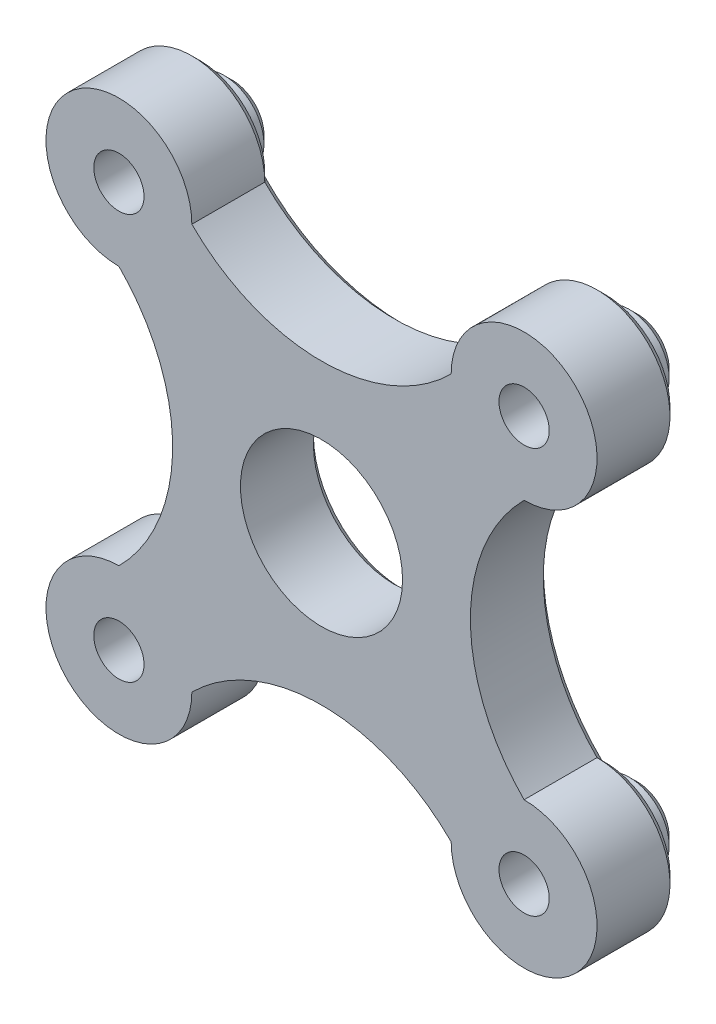
ISO-10303-21;
HEADER;
FILE_DESCRIPTION(('STEP AP214'),'2;1');
FILE_NAME('part.step','',(''),(''),'','','');
FILE_SCHEMA(('AUTOMOTIVE_DESIGN { 1 0 10303 214 1 1 1 1 }'));
ENDSEC;
DATA;
#1=APPLICATION_CONTEXT('core data for automotive mechanical design processes');
#2=APPLICATION_PROTOCOL_DEFINITION('international standard','automotive_design',2000,#1);
#3=PRODUCT_CONTEXT('',#1,'mechanical');
#4=PRODUCT('Part','Part','',(#3));
#5=PRODUCT_RELATED_PRODUCT_CATEGORY('part','',(#4));
#6=PRODUCT_DEFINITION_FORMATION('','',#4);
#7=PRODUCT_DEFINITION_CONTEXT('part definition',#1,'design');
#8=PRODUCT_DEFINITION('design','',#6,#7);
#9=PRODUCT_DEFINITION_SHAPE('','',#8);
#10=(LENGTH_UNIT() NAMED_UNIT(*) SI_UNIT(.MILLI.,.METRE.));
#11=(NAMED_UNIT(*) PLANE_ANGLE_UNIT() SI_UNIT($,.RADIAN.));
#12=(NAMED_UNIT(*) SI_UNIT($,.STERADIAN.) SOLID_ANGLE_UNIT());
#13=UNCERTAINTY_MEASURE_WITH_UNIT(LENGTH_MEASURE(1.E-05),#10,'distance_accuracy_value','');
#14=(GEOMETRIC_REPRESENTATION_CONTEXT(3) GLOBAL_UNCERTAINTY_ASSIGNED_CONTEXT((#13)) GLOBAL_UNIT_ASSIGNED_CONTEXT((#10,
#11,#12)) REPRESENTATION_CONTEXT('',''));
#15=CARTESIAN_POINT('',(0.,0.,0.));
#16=DIRECTION('',(0.,0.,1.));
#17=DIRECTION('',(1.,0.,0.));
#18=AXIS2_PLACEMENT_3D('',#15,#16,#17);
#19=CARTESIAN_POINT('',(12.5000000000003,-12.5,2.));
#20=DIRECTION('',(0.,0.,-1.));
#21=DIRECTION('',(-1.,0.,0.));
#22=AXIS2_PLACEMENT_3D('',#19,#20,#21);
#23=CYLINDRICAL_SURFACE('',#22,2.45);
#24=CARTESIAN_POINT('',(12.5000000000003,-12.5,0.500000000000007));
#25=DIRECTION('',(0.,0.,1.));
#26=DIRECTION('',(1.,0.,0.));
#27=AXIS2_PLACEMENT_3D('',#24,#25,#26);
#28=CIRCLE('',#27,2.45);
#29=CARTESIAN_POINT('',(14.9500000000003,-12.5,0.500000000000007));
#30=VERTEX_POINT('',#29);
#31=EDGE_CURVE('E198',#30,#30,#28,.T.);
#32=ORIENTED_EDGE('',*,*,#31,.T.);
#33=EDGE_LOOP('',(#32));
#34=FACE_BOUND('',#33,.T.);
#35=CARTESIAN_POINT('',(12.5000000000003,-12.5,2.));
#36=DIRECTION('',(0.,0.,1.));
#37=DIRECTION('',(1.,0.,0.));
#38=AXIS2_PLACEMENT_3D('',#35,#36,#37);
#39=CIRCLE('',#38,2.45);
#40=CARTESIAN_POINT('',(14.9500000000003,-12.5,2.));
#41=VERTEX_POINT('',#40);
#42=EDGE_CURVE('E172',#41,#41,#39,.T.);
#43=ORIENTED_EDGE('',*,*,#42,.F.);
#44=EDGE_LOOP('',(#43));
#45=FACE_BOUND('',#44,.T.);
#46=ADVANCED_FACE('F53',(#34,#45),#23,.T.);
#47=CARTESIAN_POINT('',(0.,0.,0.));
#48=DIRECTION('',(0.,0.,1.));
#49=DIRECTION('',(1.,0.,0.));
#50=AXIS2_PLACEMENT_3D('',#47,#48,#49);
#51=PLANE('',#50);
#52=CARTESIAN_POINT('',(12.5000000000003,-12.5,0.));
#53=DIRECTION('',(0.,0.,1.));
#54=DIRECTION('',(1.,0.,0.));
#55=AXIS2_PLACEMENT_3D('',#52,#53,#54);
#56=CIRCLE('',#55,1.94999999999999);
#57=CARTESIAN_POINT('',(14.4500000000003,-12.5,0.));
#58=VERTEX_POINT('',#57);
#59=EDGE_CURVE('E202',#58,#58,#56,.F.);
#60=ORIENTED_EDGE('',*,*,#59,.T.);
#61=EDGE_LOOP('',(#60));
#62=FACE_BOUND('',#61,.T.);
#63=CARTESIAN_POINT('',(12.5000000000003,-12.5,0.));
#64=DIRECTION('',(0.,0.,-1.));
#65=DIRECTION('',(-1.,0.,0.));
#66=AXIS2_PLACEMENT_3D('',#63,#64,#65);
#67=CIRCLE('',#66,1.55);
#68=CARTESIAN_POINT('',(10.9500000000003,-12.5,0.));
#69=VERTEX_POINT('',#68);
#70=EDGE_CURVE('E548',#69,#69,#67,.T.);
#71=ORIENTED_EDGE('',*,*,#70,.F.);
#72=EDGE_LOOP('',(#71));
#73=FACE_BOUND('',#72,.T.);
#74=ADVANCED_FACE('F448',(#62,#73),#51,.F.);
#75=CARTESIAN_POINT('',(-20.4999999999999,-1.30971622436249E-13,7.));
#76=DIRECTION('',(0.,0.,-1.));
#77=DIRECTION('',(-1.,0.,0.));
#78=AXIS2_PLACEMENT_3D('',#75,#76,#77);
#79=CYLINDRICAL_SURFACE('',#78,11.3137084989847);
#80=DIRECTION('',(0.,0.,-1.));
#81=VECTOR('',#80,1.);
#82=CARTESIAN_POINT('',(-12.5,7.99999999999998,7.));
#83=LINE('',#82,#81);
#84=CARTESIAN_POINT('',(-12.5,7.99999999999998,7.));
#85=VERTEX_POINT('',#84);
#86=CARTESIAN_POINT('',(-12.5,7.99999999999998,2.5));
#87=VERTEX_POINT('',#86);
#88=EDGE_CURVE('E403',#85,#87,#83,.T.);
#89=ORIENTED_EDGE('',*,*,#88,.T.);
#90=CARTESIAN_POINT('',(-20.4999999999999,-1.30971622436249E-13,2.5));
#91=DIRECTION('',(0.,0.,-1.));
#92=DIRECTION('',(-1.,0.,0.));
#93=AXIS2_PLACEMENT_3D('',#90,#91,#92);
#94=CIRCLE('',#93,11.3137084989847);
#95=CARTESIAN_POINT('',(-12.4999999999997,-7.99999999999984,2.5));
#96=VERTEX_POINT('',#95);
#97=EDGE_CURVE('E68',#87,#96,#94,.T.);
#98=ORIENTED_EDGE('',*,*,#97,.T.);
#99=DIRECTION('',(0.,0.,-1.));
#100=VECTOR('',#99,1.);
#101=CARTESIAN_POINT('',(-12.4999999999997,-7.99999999999984,7.));
#102=LINE('',#101,#100);
#103=CARTESIAN_POINT('',(-12.4999999999997,-7.99999999999984,7.));
#104=VERTEX_POINT('',#103);
#105=EDGE_CURVE('E153',#104,#96,#102,.T.);
#106=ORIENTED_EDGE('',*,*,#105,.F.);
#107=CARTESIAN_POINT('',(-20.4999999999999,-1.30971622436249E-13,7.));
#108=DIRECTION('',(0.,0.,-1.));
#109=DIRECTION('',(-1.,0.,0.));
#110=AXIS2_PLACEMENT_3D('',#107,#108,#109);
#111=CIRCLE('',#110,11.3137084989847);
#112=EDGE_CURVE('E161',#85,#104,#111,.T.);
#113=ORIENTED_EDGE('',*,*,#112,.F.);
#114=EDGE_LOOP('',(#89,#98,#106,#113));
#115=FACE_BOUND('',#114,.T.);
#116=ADVANCED_FACE('F170',(#115),#79,.F.);
#117=CARTESIAN_POINT('',(-12.4999999999997,-12.5,7.));
#118=DIRECTION('',(0.,0.,-1.));
#119=DIRECTION('',(-1.,0.,0.));
#120=AXIS2_PLACEMENT_3D('',#117,#118,#119);
#121=CYLINDRICAL_SURFACE('',#120,4.50000000000016);
#122=ORIENTED_EDGE('',*,*,#105,.T.);
#123=CARTESIAN_POINT('',(-12.4999999999997,-12.5,2.5));
#124=DIRECTION('',(0.,0.,-1.));
#125=DIRECTION('',(-1.,0.,0.));
#126=AXIS2_PLACEMENT_3D('',#123,#124,#125);
#127=CIRCLE('',#126,4.50000000000016);
#128=CARTESIAN_POINT('',(-7.99999999999977,-12.4999999999995,2.5));
#129=VERTEX_POINT('',#128);
#130=EDGE_CURVE('E12',#96,#129,#127,.F.);
#131=ORIENTED_EDGE('',*,*,#130,.T.);
#132=DIRECTION('',(0.,0.,-1.));
#133=VECTOR('',#132,1.);
#134=CARTESIAN_POINT('',(-7.99999999999977,-12.4999999999995,7.));
#135=LINE('',#134,#133);
#136=CARTESIAN_POINT('',(-7.99999999999977,-12.4999999999995,7.));
#137=VERTEX_POINT('',#136);
#138=EDGE_CURVE('E156',#137,#129,#135,.T.);
#139=ORIENTED_EDGE('',*,*,#138,.F.);
#140=CARTESIAN_POINT('',(-12.4999999999997,-12.5,7.));
#141=DIRECTION('',(0.,0.,1.));
#142=DIRECTION('',(1.,0.,0.));
#143=AXIS2_PLACEMENT_3D('',#140,#141,#142);
#144=CIRCLE('',#143,4.50000000000016);
#145=EDGE_CURVE('E150',#104,#137,#144,.T.);
#146=ORIENTED_EDGE('',*,*,#145,.F.);
#147=EDGE_LOOP('',(#122,#131,#139,#146));
#148=FACE_BOUND('',#147,.T.);
#149=ADVANCED_FACE('F152',(#148),#121,.T.);
#150=CARTESIAN_POINT('',(0.,-20.5,7.));
#151=DIRECTION('',(0.,0.,-1.));
#152=DIRECTION('',(-1.,0.,0.));
#153=AXIS2_PLACEMENT_3D('',#150,#151,#152);
#154=CYLINDRICAL_SURFACE('',#153,11.3137084989849);
#155=ORIENTED_EDGE('',*,*,#138,.T.);
#156=CARTESIAN_POINT('',(0.,-20.5,2.5));
#157=DIRECTION('',(0.,0.,-1.));
#158=DIRECTION('',(-1.,0.,0.));
#159=AXIS2_PLACEMENT_3D('',#156,#157,#158);
#160=CIRCLE('',#159,11.3137084989849);
#161=CARTESIAN_POINT('',(8.00000000000044,-12.4999999999996,2.5));
#162=VERTEX_POINT('',#161);
#163=EDGE_CURVE('E247',#129,#162,#160,.T.);
#164=ORIENTED_EDGE('',*,*,#163,.T.);
#165=DIRECTION('',(0.,0.,-1.));
#166=VECTOR('',#165,1.);
#167=CARTESIAN_POINT('',(8.00000000000044,-12.4999999999996,7.));
#168=LINE('',#167,#166);
#169=CARTESIAN_POINT('',(8.00000000000044,-12.4999999999996,7.));
#170=VERTEX_POINT('',#169);
#171=EDGE_CURVE('E179',#170,#162,#168,.T.);
#172=ORIENTED_EDGE('',*,*,#171,.F.);
#173=CARTESIAN_POINT('',(0.,-20.5,7.));
#174=DIRECTION('',(0.,0.,-1.));
#175=DIRECTION('',(-1.,0.,0.));
#176=AXIS2_PLACEMENT_3D('',#173,#174,#175);
#177=CIRCLE('',#176,11.3137084989849);
#178=EDGE_CURVE('E160',#137,#170,#177,.T.);
#179=ORIENTED_EDGE('',*,*,#178,.F.);
#180=EDGE_LOOP('',(#155,#164,#172,#179));
#181=FACE_BOUND('',#180,.T.);
#182=ADVANCED_FACE('F382',(#181),#154,.F.);
#183=CARTESIAN_POINT('',(12.5000000000003,-12.5,7.));
#184=DIRECTION('',(0.,0.,-1.));
#185=DIRECTION('',(-1.,0.,0.));
#186=AXIS2_PLACEMENT_3D('',#183,#184,#185);
#187=CYLINDRICAL_SURFACE('',#186,4.49999999999982);
#188=ORIENTED_EDGE('',*,*,#171,.T.);
#189=CARTESIAN_POINT('',(12.5000000000003,-12.5,2.5));
#190=DIRECTION('',(0.,0.,-1.));
#191=DIRECTION('',(-1.,0.,0.));
#192=AXIS2_PLACEMENT_3D('',#189,#190,#191);
#193=CIRCLE('',#192,4.49999999999982);
#194=CARTESIAN_POINT('',(12.5,-8.00000000000004,2.5));
#195=VERTEX_POINT('',#194);
#196=EDGE_CURVE('E251',#162,#195,#193,.F.);
#197=ORIENTED_EDGE('',*,*,#196,.T.);
#198=DIRECTION('',(0.,0.,-1.));
#199=VECTOR('',#198,1.);
#200=CARTESIAN_POINT('',(12.5,-8.00000000000004,7.));
#201=LINE('',#200,#199);
#202=CARTESIAN_POINT('',(12.5,-8.00000000000004,7.));
#203=VERTEX_POINT('',#202);
#204=EDGE_CURVE('E417',#203,#195,#201,.T.);
#205=ORIENTED_EDGE('',*,*,#204,.F.);
#206=CARTESIAN_POINT('',(12.5000000000003,-12.5,7.));
#207=DIRECTION('',(0.,0.,1.));
#208=DIRECTION('',(1.,0.,0.));
#209=AXIS2_PLACEMENT_3D('',#206,#207,#208);
#210=CIRCLE('',#209,4.49999999999982);
#211=EDGE_CURVE('E387',#170,#203,#210,.T.);
#212=ORIENTED_EDGE('',*,*,#211,.F.);
#213=EDGE_LOOP('',(#188,#197,#205,#212));
#214=FACE_BOUND('',#213,.T.);
#215=ADVANCED_FACE('F422',(#214),#187,.T.);
#216=CARTESIAN_POINT('',(20.5,0.,7.));
#217=DIRECTION('',(0.,0.,-1.));
#218=DIRECTION('',(-1.,0.,0.));
#219=AXIS2_PLACEMENT_3D('',#216,#217,#218);
#220=CYLINDRICAL_SURFACE('',#219,11.3137084989847);
#221=ORIENTED_EDGE('',*,*,#204,.T.);
#222=CARTESIAN_POINT('',(20.5,0.,2.5));
#223=DIRECTION('',(0.,0.,-1.));
#224=DIRECTION('',(-1.,0.,0.));
#225=AXIS2_PLACEMENT_3D('',#222,#223,#224);
#226=CIRCLE('',#225,11.3137084989847);
#227=CARTESIAN_POINT('',(12.5,8.00000000000002,2.5));
#228=VERTEX_POINT('',#227);
#229=EDGE_CURVE('E254',#195,#228,#226,.T.);
#230=ORIENTED_EDGE('',*,*,#229,.T.);
#231=DIRECTION('',(0.,0.,-1.));
#232=VECTOR('',#231,1.);
#233=CARTESIAN_POINT('',(12.5,8.00000000000002,7.));
#234=LINE('',#233,#232);
#235=CARTESIAN_POINT('',(12.5,8.00000000000002,7.));
#236=VERTEX_POINT('',#235);
#237=EDGE_CURVE('E413',#236,#228,#234,.T.);
#238=ORIENTED_EDGE('',*,*,#237,.F.);
#239=CARTESIAN_POINT('',(20.5,0.,7.));
#240=DIRECTION('',(0.,0.,-1.));
#241=DIRECTION('',(-1.,0.,0.));
#242=AXIS2_PLACEMENT_3D('',#239,#240,#241);
#243=CIRCLE('',#242,11.3137084989847);
#244=EDGE_CURVE('E390',#203,#236,#243,.T.);
#245=ORIENTED_EDGE('',*,*,#244,.F.);
#246=EDGE_LOOP('',(#221,#230,#238,#245));
#247=FACE_BOUND('',#246,.T.);
#248=ADVANCED_FACE('F429',(#247),#220,.F.);
#249=CARTESIAN_POINT('',(12.5,12.5,7.));
#250=DIRECTION('',(0.,0.,-1.));
#251=DIRECTION('',(-1.,0.,0.));
#252=AXIS2_PLACEMENT_3D('',#249,#250,#251);
#253=CYLINDRICAL_SURFACE('',#252,4.49999999999998);
#254=ORIENTED_EDGE('',*,*,#237,.T.);
#255=CARTESIAN_POINT('',(12.5,12.5,2.5));
#256=DIRECTION('',(0.,0.,-1.));
#257=DIRECTION('',(-1.,0.,0.));
#258=AXIS2_PLACEMENT_3D('',#255,#256,#257);
#259=CIRCLE('',#258,4.49999999999998);
#260=CARTESIAN_POINT('',(8.00000000000004,12.5,2.5));
#261=VERTEX_POINT('',#260);
#262=EDGE_CURVE('E257',#228,#261,#259,.F.);
#263=ORIENTED_EDGE('',*,*,#262,.T.);
#264=DIRECTION('',(0.,0.,-1.));
#265=VECTOR('',#264,1.);
#266=CARTESIAN_POINT('',(8.00000000000004,12.5,7.));
#267=LINE('',#266,#265);
#268=CARTESIAN_POINT('',(8.00000000000004,12.5,7.));
#269=VERTEX_POINT('',#268);
#270=EDGE_CURVE('E409',#269,#261,#267,.T.);
#271=ORIENTED_EDGE('',*,*,#270,.F.);
#272=CARTESIAN_POINT('',(12.5,12.5,7.));
#273=DIRECTION('',(0.,0.,1.));
#274=DIRECTION('',(1.,0.,0.));
#275=AXIS2_PLACEMENT_3D('',#272,#273,#274);
#276=CIRCLE('',#275,4.49999999999998);
#277=EDGE_CURVE('E395',#236,#269,#276,.T.);
#278=ORIENTED_EDGE('',*,*,#277,.F.);
#279=EDGE_LOOP('',(#254,#263,#271,#278));
#280=FACE_BOUND('',#279,.T.);
#281=ADVANCED_FACE('F431',(#280),#253,.T.);
#282=CARTESIAN_POINT('',(0.,20.4999999999998,7.));
#283=DIRECTION('',(0.,0.,-1.));
#284=DIRECTION('',(-1.,0.,0.));
#285=AXIS2_PLACEMENT_3D('',#282,#283,#284);
#286=CYLINDRICAL_SURFACE('',#285,11.3137084989847);
#287=ORIENTED_EDGE('',*,*,#270,.T.);
#288=CARTESIAN_POINT('',(0.,20.4999999999998,2.5));
#289=DIRECTION('',(0.,0.,-1.));
#290=DIRECTION('',(-1.,0.,0.));
#291=AXIS2_PLACEMENT_3D('',#288,#289,#290);
#292=CIRCLE('',#291,11.3137084989847);
#293=CARTESIAN_POINT('',(-7.99999999999998,12.4999999999998,2.5));
#294=VERTEX_POINT('',#293);
#295=EDGE_CURVE('E260',#261,#294,#292,.T.);
#296=ORIENTED_EDGE('',*,*,#295,.T.);
#297=DIRECTION('',(0.,0.,-1.));
#298=VECTOR('',#297,1.);
#299=CARTESIAN_POINT('',(-7.99999999999998,12.4999999999998,7.));
#300=LINE('',#299,#298);
#301=CARTESIAN_POINT('',(-7.99999999999998,12.4999999999998,7.));
#302=VERTEX_POINT('',#301);
#303=EDGE_CURVE('E406',#302,#294,#300,.T.);
#304=ORIENTED_EDGE('',*,*,#303,.F.);
#305=CARTESIAN_POINT('',(0.,20.4999999999998,7.));
#306=DIRECTION('',(0.,0.,-1.));
#307=DIRECTION('',(-1.,0.,0.));
#308=AXIS2_PLACEMENT_3D('',#305,#306,#307);
#309=CIRCLE('',#308,11.3137084989847);
#310=EDGE_CURVE('E398',#269,#302,#309,.T.);
#311=ORIENTED_EDGE('',*,*,#310,.F.);
#312=EDGE_LOOP('',(#287,#296,#304,#311));
#313=FACE_BOUND('',#312,.T.);
#314=ADVANCED_FACE('F435',(#313),#286,.F.);
#315=CARTESIAN_POINT('',(-12.5,12.5,7.));
#316=DIRECTION('',(0.,0.,-1.));
#317=DIRECTION('',(-1.,0.,0.));
#318=AXIS2_PLACEMENT_3D('',#315,#316,#317);
#319=CYLINDRICAL_SURFACE('',#318,4.50000000000002);
#320=ORIENTED_EDGE('',*,*,#303,.T.);
#321=CARTESIAN_POINT('',(-12.5,12.5,2.5));
#322=DIRECTION('',(0.,0.,-1.));
#323=DIRECTION('',(-1.,0.,0.));
#324=AXIS2_PLACEMENT_3D('',#321,#322,#323);
#325=CIRCLE('',#324,4.50000000000002);
#326=EDGE_CURVE('E83',#294,#87,#325,.F.);
#327=ORIENTED_EDGE('',*,*,#326,.T.);
#328=ORIENTED_EDGE('',*,*,#88,.F.);
#329=CARTESIAN_POINT('',(-12.5,12.5,7.));
#330=DIRECTION('',(0.,0.,1.));
#331=DIRECTION('',(1.,0.,0.));
#332=AXIS2_PLACEMENT_3D('',#329,#330,#331);
#333=CIRCLE('',#332,4.50000000000002);
#334=EDGE_CURVE('E166',#302,#85,#333,.T.);
#335=ORIENTED_EDGE('',*,*,#334,.F.);
#336=EDGE_LOOP('',(#320,#327,#328,#335));
#337=FACE_BOUND('',#336,.T.);
#338=ADVANCED_FACE('F436',(#337),#319,.T.);
#339=CARTESIAN_POINT('',(-16.4999999999998,-6.25000000000007,7.));
#340=DIRECTION('',(0.,0.,-1.));
#341=DIRECTION('',(-1.,0.,0.));
#342=AXIS2_PLACEMENT_3D('',#339,#340,#341);
#343=PLANE('',#342);
#344=CARTESIAN_POINT('',(0.,0.,7.));
#345=DIRECTION('',(0.,0.,1.));
#346=DIRECTION('',(1.,0.,0.));
#347=AXIS2_PLACEMENT_3D('',#344,#345,#346);
#348=CIRCLE('',#347,5.);
#349=CARTESIAN_POINT('',(5.,0.,7.));
#350=VERTEX_POINT('',#349);
#351=EDGE_CURVE('E350',#350,#350,#348,.T.);
#352=ORIENTED_EDGE('',*,*,#351,.F.);
#353=EDGE_LOOP('',(#352));
#354=FACE_BOUND('',#353,.T.);
#355=CARTESIAN_POINT('',(12.5000000000003,12.5,7.));
#356=DIRECTION('',(0.,0.,-1.));
#357=DIRECTION('',(-1.,0.,0.));
#358=AXIS2_PLACEMENT_3D('',#355,#356,#357);
#359=CIRCLE('',#358,1.55);
#360=CARTESIAN_POINT('',(10.9500000000003,12.5,7.));
#361=VERTEX_POINT('',#360);
#362=EDGE_CURVE('E541',#361,#361,#359,.T.);
#363=ORIENTED_EDGE('',*,*,#362,.T.);
#364=EDGE_LOOP('',(#363));
#365=FACE_BOUND('',#364,.T.);
#366=CARTESIAN_POINT('',(-12.4999999999997,12.5,7.));
#367=DIRECTION('',(0.,0.,-1.));
#368=DIRECTION('',(-1.,0.,0.));
#369=AXIS2_PLACEMENT_3D('',#366,#367,#368);
#370=CIRCLE('',#369,1.55);
#371=CARTESIAN_POINT('',(-14.0499999999997,12.5,7.));
#372=VERTEX_POINT('',#371);
#373=EDGE_CURVE('E553',#372,#372,#370,.T.);
#374=ORIENTED_EDGE('',*,*,#373,.T.);
#375=EDGE_LOOP('',(#374));
#376=FACE_BOUND('',#375,.T.);
#377=CARTESIAN_POINT('',(-12.4999999999997,-12.5,7.));
#378=DIRECTION('',(0.,0.,-1.));
#379=DIRECTION('',(-1.,0.,0.));
#380=AXIS2_PLACEMENT_3D('',#377,#378,#379);
#381=CIRCLE('',#380,1.55);
#382=CARTESIAN_POINT('',(-14.0499999999997,-12.5,7.));
#383=VERTEX_POINT('',#382);
#384=EDGE_CURVE('E544',#383,#383,#381,.T.);
#385=ORIENTED_EDGE('',*,*,#384,.T.);
#386=EDGE_LOOP('',(#385));
#387=FACE_BOUND('',#386,.T.);
#388=CARTESIAN_POINT('',(12.5000000000003,-12.5,7.));
#389=DIRECTION('',(0.,0.,-1.));
#390=DIRECTION('',(-1.,0.,0.));
#391=AXIS2_PLACEMENT_3D('',#388,#389,#390);
#392=CIRCLE('',#391,1.55);
#393=CARTESIAN_POINT('',(10.9500000000003,-12.5,7.));
#394=VERTEX_POINT('',#393);
#395=EDGE_CURVE('E564',#394,#394,#392,.T.);
#396=ORIENTED_EDGE('',*,*,#395,.T.);
#397=EDGE_LOOP('',(#396));
#398=FACE_BOUND('',#397,.T.);
#399=ORIENTED_EDGE('',*,*,#112,.T.);
#400=ORIENTED_EDGE('',*,*,#145,.T.);
#401=ORIENTED_EDGE('',*,*,#178,.T.);
#402=ORIENTED_EDGE('',*,*,#211,.T.);
#403=ORIENTED_EDGE('',*,*,#244,.T.);
#404=ORIENTED_EDGE('',*,*,#277,.T.);
#405=ORIENTED_EDGE('',*,*,#310,.T.);
#406=ORIENTED_EDGE('',*,*,#334,.T.);
#407=EDGE_LOOP('',(#399,#400,#401,#402,#403,#404,#405,#406));
#408=FACE_BOUND('',#407,.T.);
#409=ADVANCED_FACE('F164',(#354,#365,#376,#387,#398,#408),#343,.F.);
#410=CARTESIAN_POINT('',(-16.4999999999998,-6.25000000000007,2.));
#411=DIRECTION('',(0.,0.,-1.));
#412=DIRECTION('',(-1.,0.,0.));
#413=AXIS2_PLACEMENT_3D('',#410,#411,#412);
#414=PLANE('',#413);
#415=CARTESIAN_POINT('',(0.,0.,2.));
#416=DIRECTION('',(0.,0.,-1.));
#417=DIRECTION('',(-1.,0.,0.));
#418=AXIS2_PLACEMENT_3D('',#415,#416,#417);
#419=CIRCLE('',#418,5.50000000000001);
#420=CARTESIAN_POINT('',(-5.50000000000001,0.,2.));
#421=VERTEX_POINT('',#420);
#422=EDGE_CURVE('E239',#421,#421,#419,.F.);
#423=ORIENTED_EDGE('',*,*,#422,.T.);
#424=EDGE_LOOP('',(#423));
#425=FACE_BOUND('',#424,.T.);
#426=CARTESIAN_POINT('',(12.5000000000003,-12.5,2.));
#427=DIRECTION('',(0.,0.,-1.));
#428=DIRECTION('',(-1.,0.,0.));
#429=AXIS2_PLACEMENT_3D('',#426,#427,#428);
#430=CIRCLE('',#429,3.99999999999982);
#431=CARTESIAN_POINT('',(12.3006591336099,-8.50497018546979,2.));
#432=VERTEX_POINT('',#431);
#433=CARTESIAN_POINT('',(8.50497018547003,-12.3006591336099,2.));
#434=VERTEX_POINT('',#433);
#435=EDGE_CURVE('E232',#432,#434,#430,.T.);
#436=ORIENTED_EDGE('',*,*,#435,.T.);
#437=CARTESIAN_POINT('',(0.,-20.5,2.));
#438=DIRECTION('',(0.,0.,-1.));
#439=DIRECTION('',(-1.,0.,0.));
#440=AXIS2_PLACEMENT_3D('',#437,#438,#439);
#441=CIRCLE('',#440,11.8137084989849);
#442=CARTESIAN_POINT('',(-8.50497018546921,-12.3006591336091,2.));
#443=VERTEX_POINT('',#442);
#444=EDGE_CURVE('E235',#434,#443,#441,.F.);
#445=ORIENTED_EDGE('',*,*,#444,.T.);
#446=CARTESIAN_POINT('',(-12.4999999999997,-12.5,2.));
#447=DIRECTION('',(0.,0.,-1.));
#448=DIRECTION('',(-1.,0.,0.));
#449=AXIS2_PLACEMENT_3D('',#446,#447,#448);
#450=CIRCLE('',#449,4.00000000000016);
#451=CARTESIAN_POINT('',(-12.3006591336093,-8.50497018546945,2.));
#452=VERTEX_POINT('',#451);
#453=EDGE_CURVE('E214',#443,#452,#450,.T.);
#454=ORIENTED_EDGE('',*,*,#453,.T.);
#455=CARTESIAN_POINT('',(-20.4999999999999,-1.30971622436249E-13,2.));
#456=DIRECTION('',(0.,0.,-1.));
#457=DIRECTION('',(-1.,0.,0.));
#458=AXIS2_PLACEMENT_3D('',#455,#456,#457);
#459=CIRCLE('',#458,11.8137084989847);
#460=CARTESIAN_POINT('',(-12.3006591336097,8.50497018546958,2.));
#461=VERTEX_POINT('',#460);
#462=EDGE_CURVE('E217',#452,#461,#459,.F.);
#463=ORIENTED_EDGE('',*,*,#462,.T.);
#464=CARTESIAN_POINT('',(-12.5,12.5,2.));
#465=DIRECTION('',(0.,0.,-1.));
#466=DIRECTION('',(-1.,0.,0.));
#467=AXIS2_PLACEMENT_3D('',#464,#465,#466);
#468=CIRCLE('',#467,4.00000000000002);
#469=CARTESIAN_POINT('',(-8.50497018546959,12.3006591336095,2.));
#470=VERTEX_POINT('',#469);
#471=EDGE_CURVE('E220',#461,#470,#468,.T.);
#472=ORIENTED_EDGE('',*,*,#471,.T.);
#473=CARTESIAN_POINT('',(0.,20.4999999999998,2.));
#474=DIRECTION('',(0.,0.,-1.));
#475=DIRECTION('',(-1.,0.,0.));
#476=AXIS2_PLACEMENT_3D('',#473,#474,#475);
#477=CIRCLE('',#476,11.8137084989847);
#478=CARTESIAN_POINT('',(8.50497018546962,12.3006591336097,2.));
#479=VERTEX_POINT('',#478);
#480=EDGE_CURVE('E223',#470,#479,#477,.F.);
#481=ORIENTED_EDGE('',*,*,#480,.T.);
#482=CARTESIAN_POINT('',(12.5,12.5,2.));
#483=DIRECTION('',(0.,0.,-1.));
#484=DIRECTION('',(-1.,0.,0.));
#485=AXIS2_PLACEMENT_3D('',#482,#483,#484);
#486=CIRCLE('',#485,3.99999999999999);
#487=CARTESIAN_POINT('',(12.3006591336098,8.50497018546962,2.));
#488=VERTEX_POINT('',#487);
#489=EDGE_CURVE('E226',#479,#488,#486,.T.);
#490=ORIENTED_EDGE('',*,*,#489,.T.);
#491=CARTESIAN_POINT('',(20.5,0.,2.));
#492=DIRECTION('',(0.,0.,-1.));
#493=DIRECTION('',(-1.,0.,0.));
#494=AXIS2_PLACEMENT_3D('',#491,#492,#493);
#495=CIRCLE('',#494,11.8137084989847);
#496=EDGE_CURVE('E229',#488,#432,#495,.F.);
#497=ORIENTED_EDGE('',*,*,#496,.T.);
#498=EDGE_LOOP('',(#436,#445,#454,#463,#472,#481,#490,#497));
#499=FACE_BOUND('',#498,.T.);
#500=CARTESIAN_POINT('',(12.5,12.5,2.));
#501=DIRECTION('',(0.,0.,1.));
#502=DIRECTION('',(1.,0.,0.));
#503=AXIS2_PLACEMENT_3D('',#500,#501,#502);
#504=CIRCLE('',#503,2.45);
#505=CARTESIAN_POINT('',(14.95,12.5,2.));
#506=VERTEX_POINT('',#505);
#507=EDGE_CURVE('E568',#506,#506,#504,.T.);
#508=ORIENTED_EDGE('',*,*,#507,.T.);
#509=EDGE_LOOP('',(#508));
#510=FACE_BOUND('',#509,.T.);
#511=CARTESIAN_POINT('',(-12.5,12.5,2.));
#512=DIRECTION('',(0.,0.,1.));
#513=DIRECTION('',(1.,0.,0.));
#514=AXIS2_PLACEMENT_3D('',#511,#512,#513);
#515=CIRCLE('',#514,2.45);
#516=CARTESIAN_POINT('',(-10.05,12.5,2.));
#517=VERTEX_POINT('',#516);
#518=EDGE_CURVE('E575',#517,#517,#515,.T.);
#519=ORIENTED_EDGE('',*,*,#518,.T.);
#520=EDGE_LOOP('',(#519));
#521=FACE_BOUND('',#520,.T.);
#522=CARTESIAN_POINT('',(-12.4999999999997,-12.5,2.));
#523=DIRECTION('',(0.,0.,1.));
#524=DIRECTION('',(1.,0.,0.));
#525=AXIS2_PLACEMENT_3D('',#522,#523,#524);
#526=CIRCLE('',#525,2.45);
#527=CARTESIAN_POINT('',(-10.0499999999997,-12.5,2.));
#528=VERTEX_POINT('',#527);
#529=EDGE_CURVE('E168',#528,#528,#526,.T.);
#530=ORIENTED_EDGE('',*,*,#529,.T.);
#531=EDGE_LOOP('',(#530));
#532=FACE_BOUND('',#531,.T.);
#533=ORIENTED_EDGE('',*,*,#42,.T.);
#534=EDGE_LOOP('',(#533));
#535=FACE_BOUND('',#534,.T.);
#536=ADVANCED_FACE('F361',(#425,#499,#510,#521,#532,#535),#414,.T.);
#537=CARTESIAN_POINT('',(-12.4999999999997,-12.5,2.));
#538=DIRECTION('',(0.,0.,-1.));
#539=DIRECTION('',(-1.,0.,0.));
#540=AXIS2_PLACEMENT_3D('',#537,#538,#539);
#541=CYLINDRICAL_SURFACE('',#540,2.45);
#542=CARTESIAN_POINT('',(-12.4999999999997,-12.5,0.500000000000007));
#543=DIRECTION('',(0.,0.,1.));
#544=DIRECTION('',(1.,0.,0.));
#545=AXIS2_PLACEMENT_3D('',#542,#543,#544);
#546=CIRCLE('',#545,2.45);
#547=CARTESIAN_POINT('',(-10.0499999999997,-12.5,0.500000000000007));
#548=VERTEX_POINT('',#547);
#549=EDGE_CURVE('E206',#548,#548,#546,.T.);
#550=ORIENTED_EDGE('',*,*,#549,.T.);
#551=EDGE_LOOP('',(#550));
#552=FACE_BOUND('',#551,.T.);
#553=ORIENTED_EDGE('',*,*,#529,.F.);
#554=EDGE_LOOP('',(#553));
#555=FACE_BOUND('',#554,.T.);
#556=ADVANCED_FACE('F486',(#552,#555),#541,.T.);
#557=CARTESIAN_POINT('',(0.,0.,0.));
#558=DIRECTION('',(0.,0.,1.));
#559=DIRECTION('',(1.,0.,0.));
#560=AXIS2_PLACEMENT_3D('',#557,#558,#559);
#561=PLANE('',#560);
#562=CARTESIAN_POINT('',(-12.4999999999997,-12.5,0.));
#563=DIRECTION('',(0.,0.,1.));
#564=DIRECTION('',(1.,0.,0.));
#565=AXIS2_PLACEMENT_3D('',#562,#563,#564);
#566=CIRCLE('',#565,1.95);
#567=CARTESIAN_POINT('',(-10.5499999999997,-12.5,0.));
#568=VERTEX_POINT('',#567);
#569=EDGE_CURVE('E210',#568,#568,#566,.F.);
#570=ORIENTED_EDGE('',*,*,#569,.T.);
#571=EDGE_LOOP('',(#570));
#572=FACE_BOUND('',#571,.T.);
#573=CARTESIAN_POINT('',(-12.4999999999997,-12.5,0.));
#574=DIRECTION('',(0.,0.,-1.));
#575=DIRECTION('',(-1.,0.,0.));
#576=AXIS2_PLACEMENT_3D('',#573,#574,#575);
#577=CIRCLE('',#576,1.55);
#578=CARTESIAN_POINT('',(-14.0499999999997,-12.5,0.));
#579=VERTEX_POINT('',#578);
#580=EDGE_CURVE('E549',#579,#579,#577,.T.);
#581=ORIENTED_EDGE('',*,*,#580,.F.);
#582=EDGE_LOOP('',(#581));
#583=FACE_BOUND('',#582,.T.);
#584=ADVANCED_FACE('F490',(#572,#583),#561,.F.);
#585=CARTESIAN_POINT('',(0.,0.,0.));
#586=DIRECTION('',(0.,0.,1.));
#587=DIRECTION('',(1.,0.,0.));
#588=AXIS2_PLACEMENT_3D('',#585,#586,#587);
#589=PLANE('',#588);
#590=CARTESIAN_POINT('',(-12.5,12.5,0.));
#591=DIRECTION('',(0.,0.,1.));
#592=DIRECTION('',(1.,0.,0.));
#593=AXIS2_PLACEMENT_3D('',#590,#591,#592);
#594=CIRCLE('',#593,1.94999999999999);
#595=CARTESIAN_POINT('',(-10.55,12.5,0.));
#596=VERTEX_POINT('',#595);
#597=EDGE_CURVE('E186',#596,#596,#594,.F.);
#598=ORIENTED_EDGE('',*,*,#597,.T.);
#599=EDGE_LOOP('',(#598));
#600=FACE_BOUND('',#599,.T.);
#601=CARTESIAN_POINT('',(-12.4999999999997,12.5,0.));
#602=DIRECTION('',(0.,0.,-1.));
#603=DIRECTION('',(-1.,0.,0.));
#604=AXIS2_PLACEMENT_3D('',#601,#602,#603);
#605=CIRCLE('',#604,1.55);
#606=CARTESIAN_POINT('',(-14.0499999999997,12.5,0.));
#607=VERTEX_POINT('',#606);
#608=EDGE_CURVE('E557',#607,#607,#605,.T.);
#609=ORIENTED_EDGE('',*,*,#608,.F.);
#610=EDGE_LOOP('',(#609));
#611=FACE_BOUND('',#610,.T.);
#612=ADVANCED_FACE('F495',(#600,#611),#589,.F.);
#613=CARTESIAN_POINT('',(-12.5,12.5,2.));
#614=DIRECTION('',(0.,0.,-1.));
#615=DIRECTION('',(-1.,0.,0.));
#616=AXIS2_PLACEMENT_3D('',#613,#614,#615);
#617=CYLINDRICAL_SURFACE('',#616,2.45);
#618=CARTESIAN_POINT('',(-12.5,12.5,0.500000000000007));
#619=DIRECTION('',(0.,0.,1.));
#620=DIRECTION('',(1.,0.,0.));
#621=AXIS2_PLACEMENT_3D('',#618,#619,#620);
#622=CIRCLE('',#621,2.45);
#623=CARTESIAN_POINT('',(-10.05,12.5,0.500000000000007));
#624=VERTEX_POINT('',#623);
#625=EDGE_CURVE('E177',#624,#624,#622,.T.);
#626=ORIENTED_EDGE('',*,*,#625,.T.);
#627=EDGE_LOOP('',(#626));
#628=FACE_BOUND('',#627,.T.);
#629=ORIENTED_EDGE('',*,*,#518,.F.);
#630=EDGE_LOOP('',(#629));
#631=FACE_BOUND('',#630,.T.);
#632=ADVANCED_FACE('F497',(#628,#631),#617,.T.);
#633=CARTESIAN_POINT('',(12.5,12.5,2.));
#634=DIRECTION('',(0.,0.,-1.));
#635=DIRECTION('',(-1.,0.,0.));
#636=AXIS2_PLACEMENT_3D('',#633,#634,#635);
#637=CYLINDRICAL_SURFACE('',#636,2.45);
#638=CARTESIAN_POINT('',(12.5,12.5,0.500000000000007));
#639=DIRECTION('',(0.,0.,1.));
#640=DIRECTION('',(1.,0.,0.));
#641=AXIS2_PLACEMENT_3D('',#638,#639,#640);
#642=CIRCLE('',#641,2.45);
#643=CARTESIAN_POINT('',(14.95,12.5,0.500000000000007));
#644=VERTEX_POINT('',#643);
#645=EDGE_CURVE('E190',#644,#644,#642,.T.);
#646=ORIENTED_EDGE('',*,*,#645,.T.);
#647=EDGE_LOOP('',(#646));
#648=FACE_BOUND('',#647,.T.);
#649=ORIENTED_EDGE('',*,*,#507,.F.);
#650=EDGE_LOOP('',(#649));
#651=FACE_BOUND('',#650,.T.);
#652=ADVANCED_FACE('F502',(#648,#651),#637,.T.);
#653=CARTESIAN_POINT('',(12.5,12.5,0.));
#654=DIRECTION('',(0.,0.,1.));
#655=DIRECTION('',(1.,0.,0.));
#656=AXIS2_PLACEMENT_3D('',#653,#654,#655);
#657=PLANE('',#656);
#658=CARTESIAN_POINT('',(12.5,12.5,0.));
#659=DIRECTION('',(0.,0.,1.));
#660=DIRECTION('',(1.,0.,0.));
#661=AXIS2_PLACEMENT_3D('',#658,#659,#660);
#662=CIRCLE('',#661,1.94999999999999);
#663=CARTESIAN_POINT('',(14.45,12.5,0.));
#664=VERTEX_POINT('',#663);
#665=EDGE_CURVE('E194',#664,#664,#662,.F.);
#666=ORIENTED_EDGE('',*,*,#665,.T.);
#667=EDGE_LOOP('',(#666));
#668=FACE_BOUND('',#667,.T.);
#669=CARTESIAN_POINT('',(12.5000000000003,12.5,0.));
#670=DIRECTION('',(0.,0.,-1.));
#671=DIRECTION('',(-1.,0.,0.));
#672=AXIS2_PLACEMENT_3D('',#669,#670,#671);
#673=CIRCLE('',#672,1.55);
#674=CARTESIAN_POINT('',(10.9500000000003,12.5,0.));
#675=VERTEX_POINT('',#674);
#676=EDGE_CURVE('E537',#675,#675,#673,.T.);
#677=ORIENTED_EDGE('',*,*,#676,.F.);
#678=EDGE_LOOP('',(#677));
#679=FACE_BOUND('',#678,.T.);
#680=ADVANCED_FACE('F506',(#668,#679),#657,.F.);
#681=CARTESIAN_POINT('',(12.5000000000003,12.5,7.));
#682=DIRECTION('',(0.,0.,-1.));
#683=DIRECTION('',(-1.,0.,0.));
#684=AXIS2_PLACEMENT_3D('',#681,#682,#683);
#685=CYLINDRICAL_SURFACE('',#684,1.55);
#686=ORIENTED_EDGE('',*,*,#362,.F.);
#687=EDGE_LOOP('',(#686));
#688=FACE_BOUND('',#687,.T.);
#689=ORIENTED_EDGE('',*,*,#676,.T.);
#690=EDGE_LOOP('',(#689));
#691=FACE_BOUND('',#690,.T.);
#692=ADVANCED_FACE('F509',(#688,#691),#685,.F.);
#693=CARTESIAN_POINT('',(-12.4999999999997,12.5,7.));
#694=DIRECTION('',(0.,0.,-1.));
#695=DIRECTION('',(-1.,0.,0.));
#696=AXIS2_PLACEMENT_3D('',#693,#694,#695);
#697=CYLINDRICAL_SURFACE('',#696,1.55);
#698=ORIENTED_EDGE('',*,*,#373,.F.);
#699=EDGE_LOOP('',(#698));
#700=FACE_BOUND('',#699,.T.);
#701=ORIENTED_EDGE('',*,*,#608,.T.);
#702=EDGE_LOOP('',(#701));
#703=FACE_BOUND('',#702,.T.);
#704=ADVANCED_FACE('F521',(#700,#703),#697,.F.);
#705=CARTESIAN_POINT('',(-12.4999999999997,-12.5,7.));
#706=DIRECTION('',(0.,0.,-1.));
#707=DIRECTION('',(-1.,0.,0.));
#708=AXIS2_PLACEMENT_3D('',#705,#706,#707);
#709=CYLINDRICAL_SURFACE('',#708,1.55);
#710=ORIENTED_EDGE('',*,*,#384,.F.);
#711=EDGE_LOOP('',(#710));
#712=FACE_BOUND('',#711,.T.);
#713=ORIENTED_EDGE('',*,*,#580,.T.);
#714=EDGE_LOOP('',(#713));
#715=FACE_BOUND('',#714,.T.);
#716=ADVANCED_FACE('F517',(#712,#715),#709,.F.);
#717=CARTESIAN_POINT('',(12.5000000000003,-12.5,7.));
#718=DIRECTION('',(0.,0.,-1.));
#719=DIRECTION('',(-1.,0.,0.));
#720=AXIS2_PLACEMENT_3D('',#717,#718,#719);
#721=CYLINDRICAL_SURFACE('',#720,1.55);
#722=ORIENTED_EDGE('',*,*,#395,.F.);
#723=EDGE_LOOP('',(#722));
#724=FACE_BOUND('',#723,.T.);
#725=ORIENTED_EDGE('',*,*,#70,.T.);
#726=EDGE_LOOP('',(#725));
#727=FACE_BOUND('',#726,.T.);
#728=ADVANCED_FACE('F514',(#724,#727),#721,.F.);
#729=CARTESIAN_POINT('',(0.,0.,2.));
#730=DIRECTION('',(0.,0.,1.));
#731=DIRECTION('',(1.,0.,0.));
#732=AXIS2_PLACEMENT_3D('',#729,#730,#731);
#733=CYLINDRICAL_SURFACE('',#732,5.);
#734=CARTESIAN_POINT('',(0.,0.,2.5));
#735=DIRECTION('',(0.,0.,-1.));
#736=DIRECTION('',(-1.,0.,0.));
#737=AXIS2_PLACEMENT_3D('',#734,#735,#736);
#738=CIRCLE('',#737,5.);
#739=CARTESIAN_POINT('',(-5.,0.,2.5));
#740=VERTEX_POINT('',#739);
#741=EDGE_CURVE('E243',#740,#740,#738,.T.);
#742=ORIENTED_EDGE('',*,*,#741,.T.);
#743=EDGE_LOOP('',(#742));
#744=FACE_BOUND('',#743,.T.);
#745=ORIENTED_EDGE('',*,*,#351,.T.);
#746=EDGE_LOOP('',(#745));
#747=FACE_BOUND('',#746,.T.);
#748=ADVANCED_FACE('F463',(#744,#747),#733,.F.);
#749=CARTESIAN_POINT('',(-12.5,12.5,0.500000000000007));
#750=DIRECTION('',(0.,0.,1.));
#751=DIRECTION('',(1.,0.,0.));
#752=AXIS2_PLACEMENT_3D('',#749,#750,#751);
#753=CONICAL_SURFACE('',#752,2.45,0.78539816339745);
#754=ORIENTED_EDGE('',*,*,#597,.F.);
#755=EDGE_LOOP('',(#754));
#756=FACE_BOUND('',#755,.T.);
#757=ORIENTED_EDGE('',*,*,#625,.F.);
#758=EDGE_LOOP('',(#757));
#759=FACE_BOUND('',#758,.T.);
#760=ADVANCED_FACE('F459',(#756,#759),#753,.T.);
#761=CARTESIAN_POINT('',(12.5,12.5,0.500000000000007));
#762=DIRECTION('',(0.,0.,1.));
#763=DIRECTION('',(1.,0.,0.));
#764=AXIS2_PLACEMENT_3D('',#761,#762,#763);
#765=CONICAL_SURFACE('',#764,2.45,0.78539816339745);
#766=ORIENTED_EDGE('',*,*,#665,.F.);
#767=EDGE_LOOP('',(#766));
#768=FACE_BOUND('',#767,.T.);
#769=ORIENTED_EDGE('',*,*,#645,.F.);
#770=EDGE_LOOP('',(#769));
#771=FACE_BOUND('',#770,.T.);
#772=ADVANCED_FACE('F462',(#768,#771),#765,.T.);
#773=CARTESIAN_POINT('',(12.5000000000003,-12.5,0.500000000000007));
#774=DIRECTION('',(0.,0.,1.));
#775=DIRECTION('',(1.,0.,0.));
#776=AXIS2_PLACEMENT_3D('',#773,#774,#775);
#777=CONICAL_SURFACE('',#776,2.45,0.78539816339745);
#778=ORIENTED_EDGE('',*,*,#59,.F.);
#779=EDGE_LOOP('',(#778));
#780=FACE_BOUND('',#779,.T.);
#781=ORIENTED_EDGE('',*,*,#31,.F.);
#782=EDGE_LOOP('',(#781));
#783=FACE_BOUND('',#782,.T.);
#784=ADVANCED_FACE('F467',(#780,#783),#777,.T.);
#785=CARTESIAN_POINT('',(-12.4999999999997,-12.5,0.500000000000007));
#786=DIRECTION('',(0.,0.,1.));
#787=DIRECTION('',(1.,0.,0.));
#788=AXIS2_PLACEMENT_3D('',#785,#786,#787);
#789=CONICAL_SURFACE('',#788,2.45,0.785398163397448);
#790=ORIENTED_EDGE('',*,*,#569,.F.);
#791=EDGE_LOOP('',(#790));
#792=FACE_BOUND('',#791,.T.);
#793=ORIENTED_EDGE('',*,*,#549,.F.);
#794=EDGE_LOOP('',(#793));
#795=FACE_BOUND('',#794,.T.);
#796=ADVANCED_FACE('F471',(#792,#795),#789,.T.);
#797=CARTESIAN_POINT('',(0.,0.,2.));
#798=DIRECTION('',(0.,0.,-1.));
#799=DIRECTION('',(-1.,0.,0.));
#800=AXIS2_PLACEMENT_3D('',#797,#798,#799);
#801=CONICAL_SURFACE('',#800,5.50000000000001,0.785398163397452);
#802=ORIENTED_EDGE('',*,*,#741,.F.);
#803=EDGE_LOOP('',(#802));
#804=FACE_BOUND('',#803,.T.);
#805=ORIENTED_EDGE('',*,*,#422,.F.);
#806=EDGE_LOOP('',(#805));
#807=FACE_BOUND('',#806,.T.);
#808=ADVANCED_FACE('F474',(#804,#807),#801,.F.);
#809=CARTESIAN_POINT('',(0.,20.4999999999998,2.5));
#810=DIRECTION('',(0.,0.,-1.));
#811=DIRECTION('',(-1.,0.,0.));
#812=AXIS2_PLACEMENT_3D('',#809,#810,#811);
#813=CONICAL_SURFACE('',#812,11.3137084989847,0.78539816339745);
#814=CARTESIAN_POINT('',(8.00000000000003,12.5,2.5));
#815=CARTESIAN_POINT('',(8.08346718895377,12.4653945307998,2.41651650745886));
#816=CARTESIAN_POINT('',(8.16728156718771,12.4314800817366,2.3331081582715));
#817=CARTESIAN_POINT('',(8.3356049602156,12.3650331220365,2.16644149114413));
#818=CARTESIAN_POINT('',(8.42011397713819,12.3325006156363,2.08318317366482));
#819=CARTESIAN_POINT('',(8.50497018546962,12.3006591336097,2.));
#820=B_SPLINE_CURVE_WITH_KNOTS('',3,(#814,#815,#816,#817,#818,#819),.UNSPECIFIED.,.F.,.F.,(4,2,
4),(0.,0.369036492929227,0.738074117149936),.UNSPECIFIED.);
#821=EDGE_CURVE('E337',#479,#261,#820,.F.);
#822=ORIENTED_EDGE('',*,*,#821,.F.);
#823=ORIENTED_EDGE('',*,*,#480,.F.);
#824=CARTESIAN_POINT('',(-7.99999999999997,12.4999999999998,2.5));
#825=CARTESIAN_POINT('',(-8.08346718895372,12.4653945307997,2.41651650745886));
#826=CARTESIAN_POINT('',(-8.16728156718767,12.4314800817364,2.33310815827151));
#827=CARTESIAN_POINT('',(-8.33560496021557,12.3650331220363,2.16644149114413));
#828=CARTESIAN_POINT('',(-8.42011397713816,12.3325006156361,2.08318317366482));
#829=CARTESIAN_POINT('',(-8.50497018546959,12.3006591336095,2.));
#830=B_SPLINE_CURVE_WITH_KNOTS('',3,(#824,#825,#826,#827,#828,#829),.UNSPECIFIED.,.F.,.F.,(4,2,
4),(0.,0.369036492929229,0.738074117149944),.UNSPECIFIED.);
#831=EDGE_CURVE('E58',#294,#470,#830,.T.);
#832=ORIENTED_EDGE('',*,*,#831,.F.);
#833=ORIENTED_EDGE('',*,*,#295,.F.);
#834=EDGE_LOOP('',(#822,#823,#832,#833));
#835=FACE_BOUND('',#834,.T.);
#836=ADVANCED_FACE('F55',(#835),#813,.F.);
#837=CARTESIAN_POINT('',(-12.5,12.5,2.5));
#838=DIRECTION('',(0.,0.,1.));
#839=DIRECTION('',(1.,0.,0.));
#840=AXIS2_PLACEMENT_3D('',#837,#838,#839);
#841=CONICAL_SURFACE('',#840,4.50000000000002,0.78539816339745);
#842=ORIENTED_EDGE('',*,*,#831,.T.);
#843=ORIENTED_EDGE('',*,*,#471,.F.);
#844=CARTESIAN_POINT('',(-12.5,7.99999999999998,2.5));
#845=CARTESIAN_POINT('',(-12.4653945307999,8.08346718895372,2.41651650745886));
#846=CARTESIAN_POINT('',(-12.4314800817366,8.16728156718767,2.33310815827151));
#847=CARTESIAN_POINT('',(-12.3650331220365,8.33560496021557,2.16644149114413));
#848=CARTESIAN_POINT('',(-12.3325006156363,8.42011397713815,2.08318317366482));
#849=CARTESIAN_POINT('',(-12.3006591336097,8.50497018546958,2.));
#850=B_SPLINE_CURVE_WITH_KNOTS('',3,(#844,#845,#846,#847,#848,#849),.UNSPECIFIED.,.F.,.F.,(4,2,
4),(0.,0.369036492929229,0.73807411714994),.UNSPECIFIED.);
#851=EDGE_CURVE('E325',#87,#461,#850,.T.);
#852=ORIENTED_EDGE('',*,*,#851,.F.);
#853=ORIENTED_EDGE('',*,*,#326,.F.);
#854=EDGE_LOOP('',(#842,#843,#852,#853));
#855=FACE_BOUND('',#854,.T.);
#856=ADVANCED_FACE('F333',(#855),#841,.T.);
#857=CARTESIAN_POINT('',(12.5,12.5,2.5));
#858=DIRECTION('',(0.,0.,1.));
#859=DIRECTION('',(1.,0.,0.));
#860=AXIS2_PLACEMENT_3D('',#857,#858,#859);
#861=CONICAL_SURFACE('',#860,4.49999999999998,0.78539816339745);
#862=ORIENTED_EDGE('',*,*,#821,.T.);
#863=ORIENTED_EDGE('',*,*,#262,.F.);
#864=CARTESIAN_POINT('',(12.5,8.00000000000001,2.5));
#865=CARTESIAN_POINT('',(12.4653945307999,8.08346718895375,2.41651650745886));
#866=CARTESIAN_POINT('',(12.4314800817367,8.1672815671877,2.33310815827151));
#867=CARTESIAN_POINT('',(12.3650331220366,8.3356049602156,2.16644149114413));
#868=CARTESIAN_POINT('',(12.3325006156364,8.42011397713819,2.08318317366482));
#869=CARTESIAN_POINT('',(12.3006591336098,8.50497018546962,2.));
#870=B_SPLINE_CURVE_WITH_KNOTS('',3,(#864,#865,#866,#867,#868,#869),.UNSPECIFIED.,.F.,.F.,(4,2,
4),(0.,0.369036492929226,0.738074117149937),.UNSPECIFIED.);
#871=EDGE_CURVE('E317',#488,#228,#870,.F.);
#872=ORIENTED_EDGE('',*,*,#871,.F.);
#873=ORIENTED_EDGE('',*,*,#489,.F.);
#874=EDGE_LOOP('',(#862,#863,#872,#873));
#875=FACE_BOUND('',#874,.T.);
#876=ADVANCED_FACE('F330',(#875),#861,.T.);
#877=CARTESIAN_POINT('',(-20.4999999999999,-1.30971622436249E-13,2.5));
#878=DIRECTION('',(0.,0.,-1.));
#879=DIRECTION('',(-1.,0.,0.));
#880=AXIS2_PLACEMENT_3D('',#877,#878,#879);
#881=CONICAL_SURFACE('',#880,11.3137084989847,0.78539816339745);
#882=ORIENTED_EDGE('',*,*,#851,.T.);
#883=ORIENTED_EDGE('',*,*,#462,.F.);
#884=CARTESIAN_POINT('',(-12.4999999999997,-7.99999999999988,2.5));
#885=CARTESIAN_POINT('',(-12.4653945307995,-8.0834671889536,2.41651650745886));
#886=CARTESIAN_POINT('',(-12.4314800817362,-8.16728156718754,2.33310815827151));
#887=CARTESIAN_POINT('',(-12.3650331220361,-8.33560496021542,2.16644149114413));
#888=CARTESIAN_POINT('',(-12.3325006156359,-8.42011397713801,2.08318317366482));
#889=CARTESIAN_POINT('',(-12.3006591336093,-8.50497018546945,2.));
#890=B_SPLINE_CURVE_WITH_KNOTS('',3,(#884,#885,#886,#887,#888,#889),.UNSPECIFIED.,.F.,.F.,(4,2,
4),(0.,0.369036492929233,0.738074117149949),.UNSPECIFIED.);
#891=EDGE_CURVE('E302',#96,#452,#890,.T.);
#892=ORIENTED_EDGE('',*,*,#891,.F.);
#893=ORIENTED_EDGE('',*,*,#97,.F.);
#894=EDGE_LOOP('',(#882,#883,#892,#893));
#895=FACE_BOUND('',#894,.T.);
#896=ADVANCED_FACE('F312',(#895),#881,.F.);
#897=CARTESIAN_POINT('',(20.5,0.,2.5));
#898=DIRECTION('',(0.,0.,-1.));
#899=DIRECTION('',(-1.,0.,0.));
#900=AXIS2_PLACEMENT_3D('',#897,#898,#899);
#901=CONICAL_SURFACE('',#900,11.3137084989847,0.78539816339745);
#902=ORIENTED_EDGE('',*,*,#871,.T.);
#903=ORIENTED_EDGE('',*,*,#229,.F.);
#904=CARTESIAN_POINT('',(12.5,-8.00000000000011,2.5));
#905=CARTESIAN_POINT('',(12.4653945308,-8.08346718895389,2.41651650745886));
#906=CARTESIAN_POINT('',(12.4314800817368,-8.16728156718786,2.33310815827151));
#907=CARTESIAN_POINT('',(12.3650331220367,-8.33560496021578,2.16644149114414));
#908=CARTESIAN_POINT('',(12.3325006156365,-8.42011397713837,2.08318317366482));
#909=CARTESIAN_POINT('',(12.3006591336099,-8.50497018546979,2.));
#910=B_SPLINE_CURVE_WITH_KNOTS('',3,(#904,#905,#906,#907,#908,#909),.UNSPECIFIED.,.F.,.F.,(4,2,
4),(0.,0.369036492929229,0.738074117149947),.UNSPECIFIED.);
#911=EDGE_CURVE('E294',#432,#195,#910,.F.);
#912=ORIENTED_EDGE('',*,*,#911,.F.);
#913=ORIENTED_EDGE('',*,*,#496,.F.);
#914=EDGE_LOOP('',(#902,#903,#912,#913));
#915=FACE_BOUND('',#914,.T.);
#916=ADVANCED_FACE('F309',(#915),#901,.F.);
#917=CARTESIAN_POINT('',(-12.4999999999997,-12.5,2.5));
#918=DIRECTION('',(0.,0.,1.));
#919=DIRECTION('',(1.,0.,0.));
#920=AXIS2_PLACEMENT_3D('',#917,#918,#919);
#921=CONICAL_SURFACE('',#920,4.50000000000016,0.78539816339745);
#922=ORIENTED_EDGE('',*,*,#891,.T.);
#923=ORIENTED_EDGE('',*,*,#453,.F.);
#924=CARTESIAN_POINT('',(-8.50497018546921,-12.3006591336091,2.));
#925=CARTESIAN_POINT('',(-8.42011397713778,-12.3325006156357,2.08318317366482));
#926=CARTESIAN_POINT('',(-8.33560496021519,-12.3650331220358,2.16644149114413));
#927=CARTESIAN_POINT('',(-8.16728156718728,-12.431480081736,2.3331081582715));
#928=CARTESIAN_POINT('',(-8.08346718895333,-12.4653945307992,2.41651650745885));
#929=CARTESIAN_POINT('',(-7.99999999999959,-12.4999999999993,2.49999999999999));
#930=B_SPLINE_CURVE_WITH_KNOTS('',3,(#924,#925,#926,#927,#928,#929),.UNSPECIFIED.,.F.,.F.,(4,2,
4),(0.,0.369037624220714,0.738074117149942),.UNSPECIFIED.);
#931=EDGE_CURVE('E276',#129,#443,#930,.F.);
#932=ORIENTED_EDGE('',*,*,#931,.F.);
#933=ORIENTED_EDGE('',*,*,#130,.F.);
#934=EDGE_LOOP('',(#922,#923,#932,#933));
#935=FACE_BOUND('',#934,.T.);
#936=ADVANCED_FACE('F289',(#935),#921,.T.);
#937=CARTESIAN_POINT('',(12.5000000000003,-12.5,2.5));
#938=DIRECTION('',(0.,0.,1.));
#939=DIRECTION('',(1.,0.,0.));
#940=AXIS2_PLACEMENT_3D('',#937,#938,#939);
#941=CONICAL_SURFACE('',#940,4.49999999999982,0.78539816339745);
#942=ORIENTED_EDGE('',*,*,#911,.T.);
#943=ORIENTED_EDGE('',*,*,#196,.F.);
#944=CARTESIAN_POINT('',(8.0000000000003,-12.4999999999998,2.5));
#945=CARTESIAN_POINT('',(8.08346718895412,-12.4653945307999,2.41651650745886));
#946=CARTESIAN_POINT('',(8.16728156718811,-12.4314800817367,2.3331081582715));
#947=CARTESIAN_POINT('',(8.33560496021605,-12.3650331220368,2.16644149114412));
#948=CARTESIAN_POINT('',(8.42011397713863,-12.3325006156366,2.08318317366482));
#949=CARTESIAN_POINT('',(8.50497018547003,-12.3006591336099,2.));
#950=B_SPLINE_CURVE_WITH_KNOTS('',3,(#944,#945,#946,#947,#948,#949),.UNSPECIFIED.,.F.,.F.,(4,2,
4),(0.,0.369036492929211,0.73807411714991),.UNSPECIFIED.);
#951=EDGE_CURVE('E267',#434,#162,#950,.F.);
#952=ORIENTED_EDGE('',*,*,#951,.F.);
#953=ORIENTED_EDGE('',*,*,#435,.F.);
#954=EDGE_LOOP('',(#942,#943,#952,#953));
#955=FACE_BOUND('',#954,.T.);
#956=ADVANCED_FACE('F286',(#955),#941,.T.);
#957=CARTESIAN_POINT('',(0.,-20.5,2.5));
#958=DIRECTION('',(0.,0.,-1.));
#959=DIRECTION('',(-1.,0.,0.));
#960=AXIS2_PLACEMENT_3D('',#957,#958,#959);
#961=CONICAL_SURFACE('',#960,11.3137084989849,0.78539816339745);
#962=ORIENTED_EDGE('',*,*,#931,.T.);
#963=ORIENTED_EDGE('',*,*,#444,.F.);
#964=ORIENTED_EDGE('',*,*,#951,.T.);
#965=ORIENTED_EDGE('',*,*,#163,.F.);
#966=EDGE_LOOP('',(#962,#963,#964,#965));
#967=FACE_BOUND('',#966,.T.);
#968=ADVANCED_FACE('F283',(#967),#961,.F.);
#969=CLOSED_SHELL('',(#46,#74,#116,#149,#182,#215,#248,#281,#314,#338,#409,#536,#556,#584,#612,
#632,#652,#680,#692,#704,#716,#728,#748,#760,#772,#784,#796,#808,#836,#856,#876,#896,#916,#936,
#956,#968));
#970=MANIFOLD_SOLID_BREP('B2',#969);
#971=ADVANCED_BREP_SHAPE_REPRESENTATION('',(#18,#970),#14);
#972=SHAPE_DEFINITION_REPRESENTATION(#9,#971);
ENDSEC;
END-ISO-10303-21;
